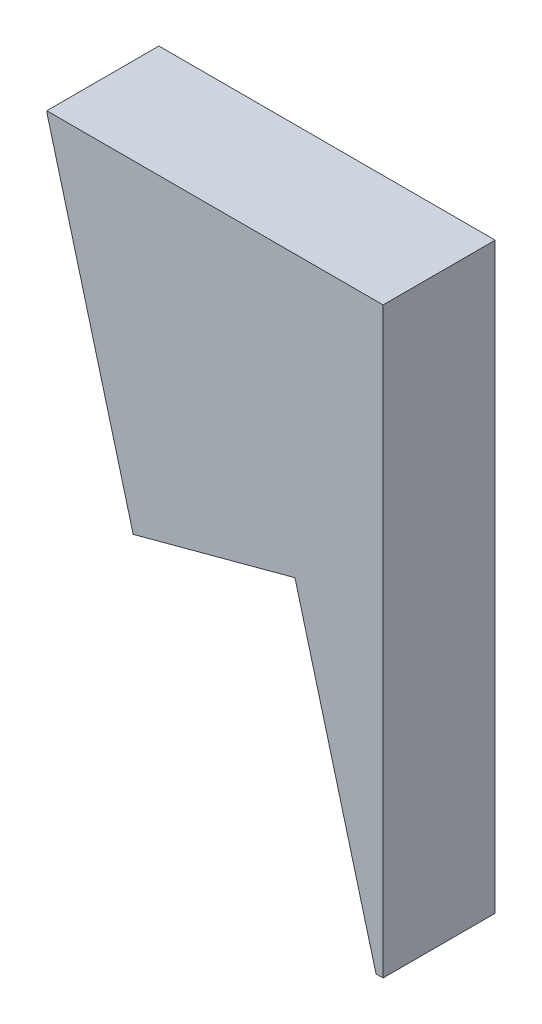
ISO-10303-21;
HEADER;
FILE_DESCRIPTION(('STEP AP214'),'2;1');
FILE_NAME('part.step','',(''),(''),'','','');
FILE_SCHEMA(('AUTOMOTIVE_DESIGN { 1 0 10303 214 1 1 1 1 }'));
ENDSEC;
DATA;
#1=APPLICATION_CONTEXT('core data for automotive mechanical design processes');
#2=APPLICATION_PROTOCOL_DEFINITION('international standard','automotive_design',2000,#1);
#3=PRODUCT_CONTEXT('',#1,'mechanical');
#4=PRODUCT('Part','Part','',(#3));
#5=PRODUCT_RELATED_PRODUCT_CATEGORY('part','',(#4));
#6=PRODUCT_DEFINITION_FORMATION('','',#4);
#7=PRODUCT_DEFINITION_CONTEXT('part definition',#1,'design');
#8=PRODUCT_DEFINITION('design','',#6,#7);
#9=PRODUCT_DEFINITION_SHAPE('','',#8);
#10=(LENGTH_UNIT() NAMED_UNIT(*) SI_UNIT(.MILLI.,.METRE.));
#11=(NAMED_UNIT(*) PLANE_ANGLE_UNIT() SI_UNIT($,.RADIAN.));
#12=(NAMED_UNIT(*) SI_UNIT($,.STERADIAN.) SOLID_ANGLE_UNIT());
#13=UNCERTAINTY_MEASURE_WITH_UNIT(LENGTH_MEASURE(1.E-05),#10,'distance_accuracy_value','');
#14=(GEOMETRIC_REPRESENTATION_CONTEXT(3) GLOBAL_UNCERTAINTY_ASSIGNED_CONTEXT((#13)) GLOBAL_UNIT_ASSIGNED_CONTEXT((#10,
#11,#12)) REPRESENTATION_CONTEXT('',''));
#15=CARTESIAN_POINT('',(0.,0.,0.));
#16=DIRECTION('',(0.,0.,1.));
#17=DIRECTION('',(1.,0.,0.));
#18=AXIS2_PLACEMENT_3D('',#15,#16,#17);
#19=CARTESIAN_POINT('',(393.331999446523,-107.170908017854,10.));
#20=DIRECTION('',(0.965925868526913,0.258818887468688,0.));
#21=DIRECTION('',(-0.258818887468688,0.965925868526913,0.));
#22=AXIS2_PLACEMENT_3D('',#19,#20,#21);
#23=PLANE('',#22);
#24=DIRECTION('',(0.258818887468688,-0.965925868526912,0.));
#25=VECTOR('',#24,1.);
#26=CARTESIAN_POINT('',(393.331999446523,-107.170908017854,0.));
#27=LINE('',#26,#25);
#28=CARTESIAN_POINT('',(393.331999446523,-107.170908017854,0.));
#29=VERTEX_POINT('',#28);
#30=CARTESIAN_POINT('',(401.038075159828,-135.930392880443,0.));
#31=VERTEX_POINT('',#30);
#32=EDGE_CURVE('E123',#29,#31,#27,.T.);
#33=ORIENTED_EDGE('',*,*,#32,.T.);
#34=DIRECTION('',(0.,0.,-1.));
#35=VECTOR('',#34,1.);
#36=CARTESIAN_POINT('',(401.038075159828,-135.930392880443,10.));
#37=LINE('',#36,#35);
#38=CARTESIAN_POINT('',(401.038075159828,-135.930392880443,10.));
#39=VERTEX_POINT('',#38);
#40=EDGE_CURVE('E11',#39,#31,#37,.T.);
#41=ORIENTED_EDGE('',*,*,#40,.F.);
#42=DIRECTION('',(0.258818887468688,-0.965925868526912,0.));
#43=VECTOR('',#42,1.);
#44=CARTESIAN_POINT('',(393.331999446523,-107.170908017854,10.));
#45=LINE('',#44,#43);
#46=CARTESIAN_POINT('',(393.331999446523,-107.170908017854,10.));
#47=VERTEX_POINT('',#46);
#48=EDGE_CURVE('E135',#47,#39,#45,.T.);
#49=ORIENTED_EDGE('',*,*,#48,.F.);
#50=DIRECTION('',(0.,0.,-1.));
#51=VECTOR('',#50,1.);
#52=CARTESIAN_POINT('',(393.331999446523,-107.170908017854,10.));
#53=LINE('',#52,#51);
#54=EDGE_CURVE('E119',#47,#29,#53,.T.);
#55=ORIENTED_EDGE('',*,*,#54,.T.);
#56=EDGE_LOOP('',(#33,#41,#49,#55));
#57=FACE_BOUND('',#56,.T.);
#58=ADVANCED_FACE('F33',(#57),#23,.F.);
#59=CARTESIAN_POINT('',(401.038075159828,-135.930392880443,10.));
#60=DIRECTION('',(-0.258819903845197,0.965925596189253,0.));
#61=DIRECTION('',(-0.965925596189253,-0.258819903845197,0.));
#62=AXIS2_PLACEMENT_3D('',#59,#60,#61);
#63=PLANE('',#62);
#64=DIRECTION('',(0.965925596189253,0.258819903845197,0.));
#65=VECTOR('',#64,1.);
#66=CARTESIAN_POINT('',(401.038075159828,-135.930392880443,0.));
#67=LINE('',#66,#65);
#68=CARTESIAN_POINT('',(415.466694883327,-132.064242129093,0.));
#69=VERTEX_POINT('',#68);
#70=EDGE_CURVE('E126',#31,#69,#67,.T.);
#71=ORIENTED_EDGE('',*,*,#70,.T.);
#72=DIRECTION('',(0.,0.,-1.));
#73=VECTOR('',#72,1.);
#74=CARTESIAN_POINT('',(415.466694883327,-132.064242129093,10.));
#75=LINE('',#74,#73);
#76=CARTESIAN_POINT('',(415.466694883327,-132.064242129093,10.));
#77=VERTEX_POINT('',#76);
#78=EDGE_CURVE('E41',#77,#69,#75,.T.);
#79=ORIENTED_EDGE('',*,*,#78,.F.);
#80=DIRECTION('',(0.965925596189253,0.258819903845197,0.));
#81=VECTOR('',#80,1.);
#82=CARTESIAN_POINT('',(401.038075159828,-135.930392880443,10.));
#83=LINE('',#82,#81);
#84=EDGE_CURVE('E89',#39,#77,#83,.T.);
#85=ORIENTED_EDGE('',*,*,#84,.F.);
#86=ORIENTED_EDGE('',*,*,#40,.T.);
#87=EDGE_LOOP('',(#71,#79,#85,#86));
#88=FACE_BOUND('',#87,.T.);
#89=ADVANCED_FACE('F160',(#88),#63,.F.);
#90=CARTESIAN_POINT('',(415.466694883327,-132.064242129093,10.));
#91=DIRECTION('',(0.965925794389338,0.258819164153907,0.));
#92=DIRECTION('',(-0.258819164153907,0.965925794389338,0.));
#93=AXIS2_PLACEMENT_3D('',#90,#91,#92);
#94=PLANE('',#93);
#95=DIRECTION('',(0.258819164153907,-0.965925794389338,0.));
#96=VECTOR('',#95,1.);
#97=CARTESIAN_POINT('',(415.466694883327,-132.064242129093,0.));
#98=LINE('',#97,#96);
#99=CARTESIAN_POINT('',(422.698940776055,-159.055337946857,0.));
#100=VERTEX_POINT('',#99);
#101=EDGE_CURVE('E128',#69,#100,#98,.T.);
#102=ORIENTED_EDGE('',*,*,#101,.T.);
#103=DIRECTION('',(0.,0.,-1.));
#104=VECTOR('',#103,1.);
#105=CARTESIAN_POINT('',(422.698940776055,-159.055337946857,10.));
#106=LINE('',#105,#104);
#107=CARTESIAN_POINT('',(422.698940776055,-159.055337946857,10.));
#108=VERTEX_POINT('',#107);
#109=EDGE_CURVE('E139',#108,#100,#106,.T.);
#110=ORIENTED_EDGE('',*,*,#109,.F.);
#111=DIRECTION('',(0.258819164153907,-0.965925794389338,0.));
#112=VECTOR('',#111,1.);
#113=CARTESIAN_POINT('',(415.466694883327,-132.064242129093,10.));
#114=LINE('',#113,#112);
#115=EDGE_CURVE('E147',#77,#108,#114,.T.);
#116=ORIENTED_EDGE('',*,*,#115,.F.);
#117=ORIENTED_EDGE('',*,*,#78,.T.);
#118=EDGE_LOOP('',(#102,#110,#116,#117));
#119=FACE_BOUND('',#118,.T.);
#120=ADVANCED_FACE('F145',(#119),#94,.F.);
#121=CARTESIAN_POINT('',(422.698940776055,-159.055337946857,10.));
#122=DIRECTION('',(0.,1.,0.));
#123=DIRECTION('',(0.,0.,1.));
#124=AXIS2_PLACEMENT_3D('',#121,#122,#123);
#125=PLANE('',#124);
#126=DIRECTION('',(1.,0.,0.));
#127=VECTOR('',#126,1.);
#128=CARTESIAN_POINT('',(422.698940776055,-159.055337946857,0.));
#129=LINE('',#128,#127);
#130=CARTESIAN_POINT('',(423.331977071628,-159.055337946857,0.));
#131=VERTEX_POINT('',#130);
#132=EDGE_CURVE('E130',#100,#131,#129,.T.);
#133=ORIENTED_EDGE('',*,*,#132,.T.);
#134=DIRECTION('',(0.,0.,-1.));
#135=VECTOR('',#134,1.);
#136=CARTESIAN_POINT('',(423.331977071628,-159.055337946857,10.));
#137=LINE('',#136,#135);
#138=CARTESIAN_POINT('',(423.331977071628,-159.055337946857,10.));
#139=VERTEX_POINT('',#138);
#140=EDGE_CURVE('E114',#139,#131,#137,.T.);
#141=ORIENTED_EDGE('',*,*,#140,.F.);
#142=DIRECTION('',(1.,0.,0.));
#143=VECTOR('',#142,1.);
#144=CARTESIAN_POINT('',(422.698940776055,-159.055337946857,10.));
#145=LINE('',#144,#143);
#146=EDGE_CURVE('E105',#108,#139,#145,.T.);
#147=ORIENTED_EDGE('',*,*,#146,.F.);
#148=ORIENTED_EDGE('',*,*,#109,.T.);
#149=EDGE_LOOP('',(#133,#141,#147,#148));
#150=FACE_BOUND('',#149,.T.);
#151=ADVANCED_FACE('F153',(#150),#125,.F.);
#152=CARTESIAN_POINT('',(423.331977071628,-159.055337946857,10.));
#153=DIRECTION('',(-1.,0.,0.));
#154=DIRECTION('',(0.,0.,1.));
#155=AXIS2_PLACEMENT_3D('',#152,#153,#154);
#156=PLANE('',#155);
#157=DIRECTION('',(0.,1.,0.));
#158=VECTOR('',#157,1.);
#159=CARTESIAN_POINT('',(423.331977071628,-159.055337946857,0.));
#160=LINE('',#159,#158);
#161=CARTESIAN_POINT('',(423.331977071628,-107.055346596142,0.));
#162=VERTEX_POINT('',#161);
#163=EDGE_CURVE('E113',#131,#162,#160,.T.);
#164=ORIENTED_EDGE('',*,*,#163,.T.);
#165=DIRECTION('',(0.,0.,-1.));
#166=VECTOR('',#165,1.);
#167=CARTESIAN_POINT('',(423.331977071628,-107.055346596142,10.));
#168=LINE('',#167,#166);
#169=CARTESIAN_POINT('',(423.331977071628,-107.055346596142,10.));
#170=VERTEX_POINT('',#169);
#171=EDGE_CURVE('E110',#170,#162,#168,.T.);
#172=ORIENTED_EDGE('',*,*,#171,.F.);
#173=DIRECTION('',(0.,1.,0.));
#174=VECTOR('',#173,1.);
#175=CARTESIAN_POINT('',(423.331977071628,-159.055337946857,10.));
#176=LINE('',#175,#174);
#177=EDGE_CURVE('E99',#139,#170,#176,.T.);
#178=ORIENTED_EDGE('',*,*,#177,.F.);
#179=ORIENTED_EDGE('',*,*,#140,.T.);
#180=EDGE_LOOP('',(#164,#172,#178,#179));
#181=FACE_BOUND('',#180,.T.);
#182=ADVANCED_FACE('F111',(#181),#156,.F.);
#183=CARTESIAN_POINT('',(423.331977071628,-107.055346596142,10.));
#184=DIRECTION('',(0.,-1.,0.));
#185=DIRECTION('',(0.,0.,-1.));
#186=AXIS2_PLACEMENT_3D('',#183,#184,#185);
#187=PLANE('',#186);
#188=DIRECTION('',(-1.,0.,0.));
#189=VECTOR('',#188,1.);
#190=CARTESIAN_POINT('',(423.331977071628,-107.055346596142,0.));
#191=LINE('',#190,#189);
#192=CARTESIAN_POINT('',(393.331999446523,-107.055346596142,0.));
#193=VERTEX_POINT('',#192);
#194=EDGE_CURVE('E75',#162,#193,#191,.T.);
#195=ORIENTED_EDGE('',*,*,#194,.T.);
#196=DIRECTION('',(0.,0.,-1.));
#197=VECTOR('',#196,1.);
#198=CARTESIAN_POINT('',(393.331999446523,-107.055346596142,10.));
#199=LINE('',#198,#197);
#200=CARTESIAN_POINT('',(393.331999446523,-107.055346596142,10.));
#201=VERTEX_POINT('',#200);
#202=EDGE_CURVE('E115',#201,#193,#199,.T.);
#203=ORIENTED_EDGE('',*,*,#202,.F.);
#204=DIRECTION('',(-1.,0.,0.));
#205=VECTOR('',#204,1.);
#206=CARTESIAN_POINT('',(423.331977071628,-107.055346596142,10.));
#207=LINE('',#206,#205);
#208=EDGE_CURVE('E103',#170,#201,#207,.T.);
#209=ORIENTED_EDGE('',*,*,#208,.F.);
#210=ORIENTED_EDGE('',*,*,#171,.T.);
#211=EDGE_LOOP('',(#195,#203,#209,#210));
#212=FACE_BOUND('',#211,.T.);
#213=ADVANCED_FACE('F117',(#212),#187,.F.);
#214=CARTESIAN_POINT('',(393.331999446523,-107.055346596142,10.));
#215=DIRECTION('',(1.,0.,0.));
#216=DIRECTION('',(0.,0.,-1.));
#217=AXIS2_PLACEMENT_3D('',#214,#215,#216);
#218=PLANE('',#217);
#219=DIRECTION('',(0.,-1.,0.));
#220=VECTOR('',#219,1.);
#221=CARTESIAN_POINT('',(393.331999446523,-107.055346596142,0.));
#222=LINE('',#221,#220);
#223=EDGE_CURVE('E81',#193,#29,#222,.T.);
#224=ORIENTED_EDGE('',*,*,#223,.T.);
#225=ORIENTED_EDGE('',*,*,#54,.F.);
#226=DIRECTION('',(0.,-1.,0.));
#227=VECTOR('',#226,1.);
#228=CARTESIAN_POINT('',(393.331999446523,-107.055346596142,10.));
#229=LINE('',#228,#227);
#230=EDGE_CURVE('E49',#201,#47,#229,.T.);
#231=ORIENTED_EDGE('',*,*,#230,.F.);
#232=ORIENTED_EDGE('',*,*,#202,.T.);
#233=EDGE_LOOP('',(#224,#225,#231,#232));
#234=FACE_BOUND('',#233,.T.);
#235=ADVANCED_FACE('F174',(#234),#218,.F.);
#236=CARTESIAN_POINT('',(0.,0.,10.));
#237=DIRECTION('',(0.,0.,1.));
#238=DIRECTION('',(1.,0.,0.));
#239=AXIS2_PLACEMENT_3D('',#236,#237,#238);
#240=PLANE('',#239);
#241=ORIENTED_EDGE('',*,*,#48,.T.);
#242=ORIENTED_EDGE('',*,*,#84,.T.);
#243=ORIENTED_EDGE('',*,*,#115,.T.);
#244=ORIENTED_EDGE('',*,*,#146,.T.);
#245=ORIENTED_EDGE('',*,*,#177,.T.);
#246=ORIENTED_EDGE('',*,*,#208,.T.);
#247=ORIENTED_EDGE('',*,*,#230,.T.);
#248=EDGE_LOOP('',(#241,#242,#243,#244,#245,#246,#247));
#249=FACE_BOUND('',#248,.T.);
#250=ADVANCED_FACE('F101',(#249),#240,.T.);
#251=CARTESIAN_POINT('',(0.,0.,0.));
#252=DIRECTION('',(0.,0.,1.));
#253=DIRECTION('',(1.,0.,0.));
#254=AXIS2_PLACEMENT_3D('',#251,#252,#253);
#255=PLANE('',#254);
#256=ORIENTED_EDGE('',*,*,#32,.F.);
#257=ORIENTED_EDGE('',*,*,#223,.F.);
#258=ORIENTED_EDGE('',*,*,#194,.F.);
#259=ORIENTED_EDGE('',*,*,#163,.F.);
#260=ORIENTED_EDGE('',*,*,#132,.F.);
#261=ORIENTED_EDGE('',*,*,#101,.F.);
#262=ORIENTED_EDGE('',*,*,#70,.F.);
#263=EDGE_LOOP('',(#256,#257,#258,#259,#260,#261,#262));
#264=FACE_BOUND('',#263,.T.);
#265=ADVANCED_FACE('F151',(#264),#255,.F.);
#266=CLOSED_SHELL('',(#58,#89,#120,#151,#182,#213,#235,#250,#265));
#267=MANIFOLD_SOLID_BREP('B2',#266);
#268=ADVANCED_BREP_SHAPE_REPRESENTATION('',(#18,#267),#14);
#269=SHAPE_DEFINITION_REPRESENTATION(#9,#268);
ENDSEC;
END-ISO-10303-21;
